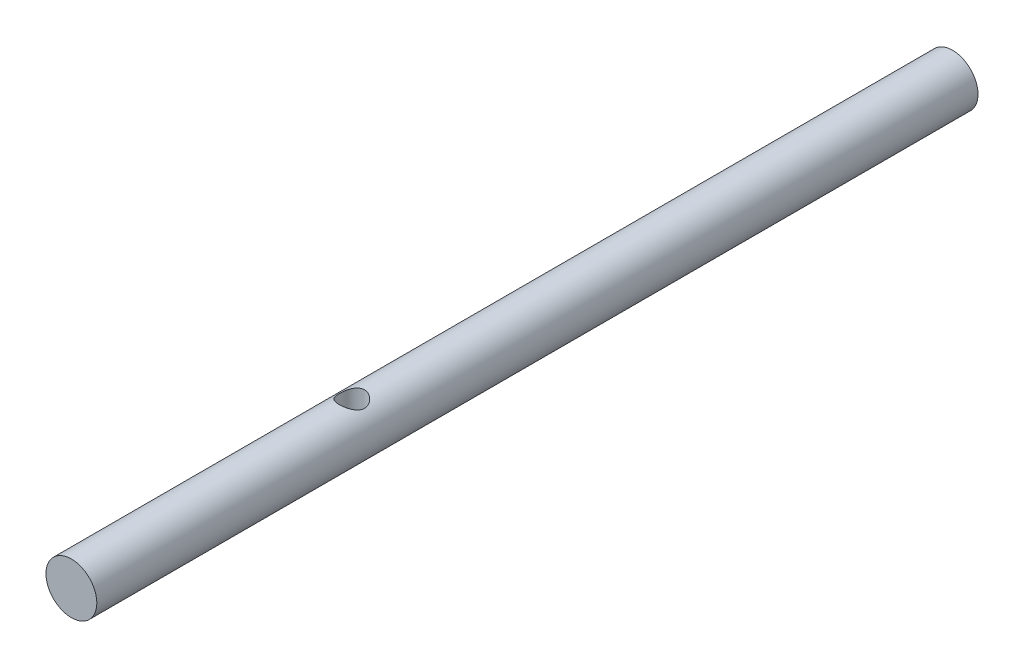
ISO-10303-21;
HEADER;
FILE_DESCRIPTION(('STEP AP214'),'2;1');
FILE_NAME('part.step','',(''),(''),'','','');
FILE_SCHEMA(('AUTOMOTIVE_DESIGN { 1 0 10303 214 1 1 1 1 }'));
ENDSEC;
DATA;
#1=APPLICATION_CONTEXT('core data for automotive mechanical design processes');
#2=APPLICATION_PROTOCOL_DEFINITION('international standard','automotive_design',2000,#1);
#3=PRODUCT_CONTEXT('',#1,'mechanical');
#4=PRODUCT('Part','Part','',(#3));
#5=PRODUCT_RELATED_PRODUCT_CATEGORY('part','',(#4));
#6=PRODUCT_DEFINITION_FORMATION('','',#4);
#7=PRODUCT_DEFINITION_CONTEXT('part definition',#1,'design');
#8=PRODUCT_DEFINITION('design','',#6,#7);
#9=PRODUCT_DEFINITION_SHAPE('','',#8);
#10=(LENGTH_UNIT() NAMED_UNIT(*) SI_UNIT(.MILLI.,.METRE.));
#11=(NAMED_UNIT(*) PLANE_ANGLE_UNIT() SI_UNIT($,.RADIAN.));
#12=(NAMED_UNIT(*) SI_UNIT($,.STERADIAN.) SOLID_ANGLE_UNIT());
#13=UNCERTAINTY_MEASURE_WITH_UNIT(LENGTH_MEASURE(1.E-05),#10,'distance_accuracy_value','');
#14=(GEOMETRIC_REPRESENTATION_CONTEXT(3) GLOBAL_UNCERTAINTY_ASSIGNED_CONTEXT((#13)) GLOBAL_UNIT_ASSIGNED_CONTEXT((#10,
#11,#12)) REPRESENTATION_CONTEXT('',''));
#15=CARTESIAN_POINT('',(0.,0.,0.));
#16=DIRECTION('',(0.,0.,1.));
#17=DIRECTION('',(1.,0.,0.));
#18=AXIS2_PLACEMENT_3D('',#15,#16,#17);
#19=CARTESIAN_POINT('',(0.,0.,27.5));
#20=DIRECTION('',(0.,0.,-1.));
#21=DIRECTION('',(-1.,0.,0.));
#22=AXIS2_PLACEMENT_3D('',#19,#20,#21);
#23=CYLINDRICAL_SURFACE('',#22,1.5875);
#24=CARTESIAN_POINT('',(0.,-1.5875,10.79375));
#25=CARTESIAN_POINT('',(0.041728995593933,-1.58749772514545,10.7937473787839));
#26=CARTESIAN_POINT('',(0.0835077385103134,-1.58583702246742,10.7904400044597));
#27=CARTESIAN_POINT('',(0.165830436744312,-1.57935736354683,10.7773567762294));
#28=CARTESIAN_POINT('',(0.206371893828843,-1.57453240964256,10.7675686380581));
#29=CARTESIAN_POINT('',(0.284903501248956,-1.56222921776378,10.7420024144104));
#30=CARTESIAN_POINT('',(0.322902899832974,-1.55476129847157,10.7262476075031));
#31=CARTESIAN_POINT('',(0.395662639590211,-1.53785710109399,10.6893158192916));
#32=CARTESIAN_POINT('',(0.430423235854602,-1.52842097821614,10.6681392655025));
#33=CARTESIAN_POINT('',(0.498084330348523,-1.50777779992333,10.619508183221));
#34=CARTESIAN_POINT('',(0.530745073828176,-1.49649814307482,10.5917513571035));
#35=CARTESIAN_POINT('',(0.591168684363163,-1.47367601383353,10.5313985758477));
#36=CARTESIAN_POINT('',(0.618927819090996,-1.46213334865921,10.4987989676556));
#37=CARTESIAN_POINT('',(0.670918775357408,-1.43906042512894,10.4266538413158));
#38=CARTESIAN_POINT('',(0.694710110094112,-1.42760054657542,10.3867657219379));
#39=CARTESIAN_POINT('',(0.735146030094489,-1.40720745650529,10.3029209270609));
#40=CARTESIAN_POINT('',(0.751795720629527,-1.39827244163048,10.2589671853263));
#41=CARTESIAN_POINT('',(0.776392625987191,-1.3847593196126,10.1709220725713));
#42=CARTESIAN_POINT('',(0.7848011490576,-1.37995240569573,10.1269964661715));
#43=CARTESIAN_POINT('',(0.794088925938896,-1.37463125146644,10.0381167975125));
#44=CARTESIAN_POINT('',(0.794975620146127,-1.37411276916235,9.99316379568352));
#45=CARTESIAN_POINT('',(0.789533034193008,-1.37724300891691,9.90928546819968));
#46=CARTESIAN_POINT('',(0.784053994132352,-1.38040081156723,9.8702821752167));
#47=CARTESIAN_POINT('',(0.76750850518894,-1.38966756557494,9.79384573443515));
#48=CARTESIAN_POINT('',(0.756440276468761,-1.39577745697722,9.75641309091391));
#49=CARTESIAN_POINT('',(0.72882901318139,-1.41039434402613,9.68311187602601));
#50=CARTESIAN_POINT('',(0.712164459523321,-1.41895386027049,9.64730004596378));
#51=CARTESIAN_POINT('',(0.673926839586477,-1.43750827148364,9.57880903025668));
#52=CARTESIAN_POINT('',(0.652351568526146,-1.44750381044276,9.54613126111743));
#53=CARTESIAN_POINT('',(0.601714931087026,-1.46933569085733,9.48047375563506));
#54=CARTESIAN_POINT('',(0.572051226330618,-1.48124473750417,9.44798110659892));
#55=CARTESIAN_POINT('',(0.507647240625965,-1.50453425994698,9.38822876149347));
#56=CARTESIAN_POINT('',(0.472904547405839,-1.51591448117298,9.3609715663231));
#57=CARTESIAN_POINT('',(0.39728497650403,-1.53750952405853,9.31127450655765));
#58=CARTESIAN_POINT('',(0.356198163332031,-1.54764568678593,9.28911712499619));
#59=CARTESIAN_POINT('',(0.270245058544233,-1.56494068139986,9.25221048319711));
#60=CARTESIAN_POINT('',(0.225381801160563,-1.57210187661445,9.23745534064421));
#61=CARTESIAN_POINT('',(0.137133402755682,-1.58213689907265,9.21698514829989));
#62=CARTESIAN_POINT('',(0.0939335898727325,-1.58531669776666,9.21062258162599));
#63=CARTESIAN_POINT('',(0.00696880745979958,-1.58807954433162,9.205087369662));
#64=CARTESIAN_POINT('',(-0.036795884521734,-1.58766429610042,9.20591131827366));
#65=CARTESIAN_POINT('',(-0.120041171513882,-1.58346133851169,9.21435155893238));
#66=CARTESIAN_POINT('',(-0.159590905139651,-1.57993751265,9.22143644785446));
#67=CARTESIAN_POINT('',(-0.236860470764646,-1.57021348481137,9.24136396956672));
#68=CARTESIAN_POINT('',(-0.274580100517228,-1.56401298777876,9.25420723712235));
#69=CARTESIAN_POINT('',(-0.348367832956921,-1.549274995596,9.28562378273133));
#70=CARTESIAN_POINT('',(-0.384357877623634,-1.54067574904889,9.30435039603022));
#71=CARTESIAN_POINT('',(-0.452803705848518,-1.52196779614205,9.34682910641904));
#72=CARTESIAN_POINT('',(-0.485257974884129,-1.51185844730342,9.37058334433353));
#73=CARTESIAN_POINT('',(-0.549090603374456,-1.48993400686612,9.42513483760797));
#74=CARTESIAN_POINT('',(-0.580050336773307,-1.4780488984845,9.45639465183502));
#75=CARTESIAN_POINT('',(-0.636473454883634,-1.45464523335575,9.52369058882001));
#76=CARTESIAN_POINT('',(-0.661933037392105,-1.44312693484086,9.5597299880605));
#77=CARTESIAN_POINT('',(-0.707793157132545,-1.42121883829441,9.63776715052149));
#78=CARTESIAN_POINT('',(-0.727888987353668,-1.41091070420381,9.67996894255307));
#79=CARTESIAN_POINT('',(-0.760478243148456,-1.393619199422,9.76783611623094));
#80=CARTESIAN_POINT('',(-0.772981464485759,-1.38663154728491,9.81349694916032));
#81=CARTESIAN_POINT('',(-0.788877714413182,-1.37764441425629,9.90229748939627));
#82=CARTESIAN_POINT('',(-0.793030065893186,-1.37523048121765,9.9452584386593));
#83=CARTESIAN_POINT('',(-0.794297016289749,-1.37450000250401,10.0313111095668));
#84=CARTESIAN_POINT('',(-0.791414665758116,-1.3761816807937,10.0744027664369));
#85=CARTESIAN_POINT('',(-0.779403862188859,-1.38301303002207,10.155165029341));
#86=CARTESIAN_POINT('',(-0.770896599509597,-1.387817062454,10.1929609981771));
#87=CARTESIAN_POINT('',(-0.748645440590813,-1.39994494099159,10.2665476947934));
#88=CARTESIAN_POINT('',(-0.7348998598581,-1.4072695975843,10.3023377732855));
#89=CARTESIAN_POINT('',(-0.701528747832417,-1.42421395976844,10.3735584754706));
#90=CARTESIAN_POINT('',(-0.681570215641813,-1.43395479651976,10.4088033970773));
#91=CARTESIAN_POINT('',(-0.636707333736578,-1.45443044484956,10.4756741630933));
#92=CARTESIAN_POINT('',(-0.611800410920677,-1.46516577199402,10.5072981110991));
#93=CARTESIAN_POINT('',(-0.55419889054006,-1.48798219007705,10.5700251984964));
#94=CARTESIAN_POINT('',(-0.520925760764324,-1.50006830503478,10.6005981624998));
#95=CARTESIAN_POINT('',(-0.449385377437347,-1.52302965852476,10.6558462430925));
#96=CARTESIAN_POINT('',(-0.411115449085074,-1.53390424270132,10.6805181806696));
#97=CARTESIAN_POINT('',(-0.330145704975833,-1.55335295108176,10.7232938629425));
#98=CARTESIAN_POINT('',(-0.2874164812481,-1.56191026646809,10.7413499344703));
#99=CARTESIAN_POINT('',(-0.199026542902264,-1.57560439707251,10.7697852332857));
#100=CARTESIAN_POINT('',(-0.153374565950888,-1.58075092927265,10.780186278421));
#101=CARTESIAN_POINT('',(-0.089377795021186,-1.58508272890795,10.7889060700415));
#102=CARTESIAN_POINT('',(-0.0715659918051022,-1.58598683737991,10.7907199711855));
#103=CARTESIAN_POINT('',(-0.0358391871219314,-1.5871959697618,10.793142515754));
#104=CARTESIAN_POINT('',(-0.017924182820109,-1.58750097713612,10.7937511259115));
#105=CARTESIAN_POINT('',(0.,-1.5875,10.79375));
#106=B_SPLINE_CURVE_WITH_KNOTS('',3,(#24,#25,#26,#27,#28,#29,#30,#31,#32,#33,#34,#35,#36,#37,
#38,#39,#40,#41,#42,#43,#44,#45,#46,#47,#48,#49,#50,#51,#52,#53,#54,#55,#56,#57,#58,#59,#60,#61,
#62,#63,#64,#65,#66,#67,#68,#69,#70,#71,#72,#73,#74,#75,#76,#77,#78,#79,#80,#81,#82,#83,#84,#85,
#86,#87,#88,#89,#90,#91,#92,#93,#94,#95,#96,#97,#98,#99,#100,#101,#102,#103,#104,#105),
.UNSPECIFIED.,.T.,.F.,(4,2,2,2,2,2,2,2,2,2,2,2,2,2,2,2,2,2,2,2,2,2,2,2,2,2,2,2,2,2,2,2,2,2,2,2,
2,2,2,2,4),(0.,0.125114254327357,0.250466343831675,0.375334335922012,0.500192484961618,
0.632604270982483,0.765116451137891,0.907904953544098,1.0505912114426,1.18473547136307,
1.3187470237991,1.43673284224898,1.55475625616007,1.67552878133737,1.79635563750301,
1.93250297183766,2.06871518087707,2.21125273882712,2.35367684674122,2.4843048681163,
2.61487098080984,2.73531732039234,2.85577694044552,2.97968079472144,3.10363751531494,
3.23976690949007,3.37599010963499,3.51881028964241,3.66144581352992,3.79038887826834,
3.91927603763879,4.03588482131319,4.15253113472044,4.27701437565643,4.40156251654047,
4.54124411434795,4.68100079305154,4.82174560844946,4.96208771221038,5.01582753609297,
5.06956884321159),.UNSPECIFIED.);
#107=CARTESIAN_POINT('',(0.,-1.5875,10.79375));
#108=VERTEX_POINT('',#107);
#109=EDGE_CURVE('E10',#108,#108,#106,.T.);
#110=ORIENTED_EDGE('',*,*,#109,.T.);
#111=EDGE_LOOP('',(#110));
#112=FACE_BOUND('',#111,.T.);
#113=CARTESIAN_POINT('',(0.,1.5875,10.79375));
#114=CARTESIAN_POINT('',(-0.041728995593933,1.58749772514545,10.7937473787839));
#115=CARTESIAN_POINT('',(-0.0835077385103134,1.58583702246742,10.7904400044597));
#116=CARTESIAN_POINT('',(-0.165830436744312,1.57935736354683,10.7773567762294));
#117=CARTESIAN_POINT('',(-0.206371893828843,1.57453240964256,10.7675686380581));
#118=CARTESIAN_POINT('',(-0.284903501248956,1.56222921776378,10.7420024144104));
#119=CARTESIAN_POINT('',(-0.322902899832974,1.55476129847157,10.7262476075031));
#120=CARTESIAN_POINT('',(-0.395662639590211,1.53785710109399,10.6893158192916));
#121=CARTESIAN_POINT('',(-0.430423235854602,1.52842097821614,10.6681392655025));
#122=CARTESIAN_POINT('',(-0.498084330348523,1.50777779992333,10.619508183221));
#123=CARTESIAN_POINT('',(-0.530745073828176,1.49649814307482,10.5917513571035));
#124=CARTESIAN_POINT('',(-0.591168684363163,1.47367601383353,10.5313985758477));
#125=CARTESIAN_POINT('',(-0.618927819090996,1.46213334865921,10.4987989676556));
#126=CARTESIAN_POINT('',(-0.670918775357408,1.43906042512894,10.4266538413158));
#127=CARTESIAN_POINT('',(-0.694710110094112,1.42760054657542,10.3867657219379));
#128=CARTESIAN_POINT('',(-0.735146030094489,1.40720745650529,10.3029209270609));
#129=CARTESIAN_POINT('',(-0.751795720629527,1.39827244163048,10.2589671853263));
#130=CARTESIAN_POINT('',(-0.776392625987191,1.3847593196126,10.1709220725713));
#131=CARTESIAN_POINT('',(-0.7848011490576,1.37995240569573,10.1269964661715));
#132=CARTESIAN_POINT('',(-0.794088925938896,1.37463125146644,10.0381167975125));
#133=CARTESIAN_POINT('',(-0.794975620146127,1.37411276916235,9.99316379568352));
#134=CARTESIAN_POINT('',(-0.789533034193008,1.37724300891691,9.90928546819968));
#135=CARTESIAN_POINT('',(-0.784053994132352,1.38040081156723,9.8702821752167));
#136=CARTESIAN_POINT('',(-0.76750850518894,1.38966756557494,9.79384573443515));
#137=CARTESIAN_POINT('',(-0.756440276468761,1.39577745697722,9.75641309091391));
#138=CARTESIAN_POINT('',(-0.72882901318139,1.41039434402613,9.68311187602601));
#139=CARTESIAN_POINT('',(-0.712164459523321,1.41895386027049,9.64730004596378));
#140=CARTESIAN_POINT('',(-0.673926839586477,1.43750827148364,9.57880903025668));
#141=CARTESIAN_POINT('',(-0.652351568526146,1.44750381044276,9.54613126111743));
#142=CARTESIAN_POINT('',(-0.601714931087026,1.46933569085733,9.48047375563506));
#143=CARTESIAN_POINT('',(-0.572051226330618,1.48124473750417,9.44798110659892));
#144=CARTESIAN_POINT('',(-0.507647240625965,1.50453425994698,9.38822876149347));
#145=CARTESIAN_POINT('',(-0.472904547405839,1.51591448117298,9.3609715663231));
#146=CARTESIAN_POINT('',(-0.39728497650403,1.53750952405853,9.31127450655765));
#147=CARTESIAN_POINT('',(-0.356198163332031,1.54764568678593,9.28911712499619));
#148=CARTESIAN_POINT('',(-0.270245058544233,1.56494068139986,9.25221048319711));
#149=CARTESIAN_POINT('',(-0.225381801160563,1.57210187661445,9.23745534064421));
#150=CARTESIAN_POINT('',(-0.137133402755682,1.58213689907265,9.21698514829989));
#151=CARTESIAN_POINT('',(-0.0939335898727325,1.58531669776666,9.21062258162599));
#152=CARTESIAN_POINT('',(-0.00696880745979958,1.58807954433162,9.205087369662));
#153=CARTESIAN_POINT('',(0.036795884521734,1.58766429610042,9.20591131827366));
#154=CARTESIAN_POINT('',(0.120041171513882,1.58346133851169,9.21435155893238));
#155=CARTESIAN_POINT('',(0.159590905139651,1.57993751265,9.22143644785446));
#156=CARTESIAN_POINT('',(0.236860470764646,1.57021348481137,9.24136396956672));
#157=CARTESIAN_POINT('',(0.274580100517228,1.56401298777876,9.25420723712235));
#158=CARTESIAN_POINT('',(0.348367832956921,1.549274995596,9.28562378273133));
#159=CARTESIAN_POINT('',(0.384357877623634,1.54067574904889,9.30435039603022));
#160=CARTESIAN_POINT('',(0.452803705848518,1.52196779614205,9.34682910641904));
#161=CARTESIAN_POINT('',(0.485257974884129,1.51185844730342,9.37058334433353));
#162=CARTESIAN_POINT('',(0.549090603374456,1.48993400686612,9.42513483760797));
#163=CARTESIAN_POINT('',(0.580050336773307,1.4780488984845,9.45639465183502));
#164=CARTESIAN_POINT('',(0.636473454883634,1.45464523335575,9.52369058882001));
#165=CARTESIAN_POINT('',(0.661933037392105,1.44312693484086,9.5597299880605));
#166=CARTESIAN_POINT('',(0.707793157132545,1.42121883829441,9.63776715052149));
#167=CARTESIAN_POINT('',(0.727888987353668,1.41091070420381,9.67996894255307));
#168=CARTESIAN_POINT('',(0.760478243148456,1.393619199422,9.76783611623094));
#169=CARTESIAN_POINT('',(0.772981464485759,1.38663154728491,9.81349694916032));
#170=CARTESIAN_POINT('',(0.788877714413182,1.37764441425629,9.90229748939627));
#171=CARTESIAN_POINT('',(0.793030065893186,1.37523048121765,9.9452584386593));
#172=CARTESIAN_POINT('',(0.794297016289749,1.37450000250401,10.0313111095668));
#173=CARTESIAN_POINT('',(0.791414665758116,1.3761816807937,10.0744027664369));
#174=CARTESIAN_POINT('',(0.779403862188859,1.38301303002207,10.155165029341));
#175=CARTESIAN_POINT('',(0.770896599509597,1.387817062454,10.1929609981771));
#176=CARTESIAN_POINT('',(0.748645440590813,1.39994494099159,10.2665476947934));
#177=CARTESIAN_POINT('',(0.7348998598581,1.4072695975843,10.3023377732855));
#178=CARTESIAN_POINT('',(0.701528747832417,1.42421395976844,10.3735584754706));
#179=CARTESIAN_POINT('',(0.681570215641813,1.43395479651976,10.4088033970773));
#180=CARTESIAN_POINT('',(0.636707333736578,1.45443044484956,10.4756741630933));
#181=CARTESIAN_POINT('',(0.611800410920677,1.46516577199402,10.5072981110991));
#182=CARTESIAN_POINT('',(0.55419889054006,1.48798219007705,10.5700251984964));
#183=CARTESIAN_POINT('',(0.520925760764324,1.50006830503478,10.6005981624998));
#184=CARTESIAN_POINT('',(0.449385377437347,1.52302965852476,10.6558462430925));
#185=CARTESIAN_POINT('',(0.411115449085074,1.53390424270132,10.6805181806696));
#186=CARTESIAN_POINT('',(0.330145704975833,1.55335295108176,10.7232938629425));
#187=CARTESIAN_POINT('',(0.2874164812481,1.56191026646809,10.7413499344703));
#188=CARTESIAN_POINT('',(0.199026542902264,1.57560439707251,10.7697852332857));
#189=CARTESIAN_POINT('',(0.153374565950888,1.58075092927265,10.780186278421));
#190=CARTESIAN_POINT('',(0.089377795021186,1.58508272890795,10.7889060700415));
#191=CARTESIAN_POINT('',(0.0715659918051022,1.58598683737991,10.7907199711855));
#192=CARTESIAN_POINT('',(0.0358391871219314,1.5871959697618,10.793142515754));
#193=CARTESIAN_POINT('',(0.017924182820109,1.58750097713612,10.7937511259115));
#194=CARTESIAN_POINT('',(0.,1.5875,10.79375));
#195=B_SPLINE_CURVE_WITH_KNOTS('',3,(#113,#114,#115,#116,#117,#118,#119,#120,#121,#122,#123,
#124,#125,#126,#127,#128,#129,#130,#131,#132,#133,#134,#135,#136,#137,#138,#139,#140,#141,#142,
#143,#144,#145,#146,#147,#148,#149,#150,#151,#152,#153,#154,#155,#156,#157,#158,#159,#160,#161,
#162,#163,#164,#165,#166,#167,#168,#169,#170,#171,#172,#173,#174,#175,#176,#177,#178,#179,#180,
#181,#182,#183,#184,#185,#186,#187,#188,#189,#190,#191,#192,#193,#194),.UNSPECIFIED.,.T.,.F.,(4,
2,2,2,2,2,2,2,2,2,2,2,2,2,2,2,2,2,2,2,2,2,2,2,2,2,2,2,2,2,2,2,2,2,2,2,2,2,2,2,4),(0.,
0.125114254327357,0.250466343831675,0.375334335922012,0.500192484961618,0.632604270982483,
0.765116451137891,0.907904953544098,1.0505912114426,1.18473547136307,1.3187470237991,
1.43673284224898,1.55475625616007,1.67552878133737,1.79635563750301,1.93250297183766,
2.06871518087707,2.21125273882712,2.35367684674122,2.4843048681163,2.61487098080984,
2.73531732039234,2.85577694044552,2.97968079472144,3.10363751531494,3.23976690949007,
3.37599010963499,3.51881028964241,3.66144581352992,3.79038887826834,3.91927603763879,
4.03588482131319,4.15253113472044,4.27701437565643,4.40156251654047,4.54124411434795,
4.68100079305154,4.82174560844946,4.96208771221038,5.01582753609297,5.06956884321159),.UNSPECIFIED.);
#196=CARTESIAN_POINT('',(0.,1.5875,10.79375));
#197=VERTEX_POINT('',#196);
#198=EDGE_CURVE('E42',#197,#197,#195,.T.);
#199=ORIENTED_EDGE('',*,*,#198,.T.);
#200=EDGE_LOOP('',(#199));
#201=FACE_BOUND('',#200,.T.);
#202=CARTESIAN_POINT('',(0.,0.,27.5));
#203=DIRECTION('',(0.,0.,1.));
#204=DIRECTION('',(1.,0.,0.));
#205=AXIS2_PLACEMENT_3D('',#202,#203,#204);
#206=CIRCLE('',#205,1.5875);
#207=CARTESIAN_POINT('',(1.5875,0.,27.5));
#208=VERTEX_POINT('',#207);
#209=EDGE_CURVE('E46',#208,#208,#206,.T.);
#210=ORIENTED_EDGE('',*,*,#209,.F.);
#211=EDGE_LOOP('',(#210));
#212=FACE_BOUND('',#211,.T.);
#213=CARTESIAN_POINT('',(0.,0.,-27.5));
#214=DIRECTION('',(0.,0.,1.));
#215=DIRECTION('',(1.,0.,0.));
#216=AXIS2_PLACEMENT_3D('',#213,#214,#215);
#217=CIRCLE('',#216,1.5875);
#218=CARTESIAN_POINT('',(1.5875,0.,-27.5));
#219=VERTEX_POINT('',#218);
#220=EDGE_CURVE('E50',#219,#219,#217,.T.);
#221=ORIENTED_EDGE('',*,*,#220,.T.);
#222=EDGE_LOOP('',(#221));
#223=FACE_BOUND('',#222,.T.);
#224=ADVANCED_FACE('F32',(#112,#201,#212,#223),#23,.T.);
#225=CARTESIAN_POINT('',(0.,0.,27.5));
#226=DIRECTION('',(0.,0.,1.));
#227=DIRECTION('',(1.,0.,0.));
#228=AXIS2_PLACEMENT_3D('',#225,#226,#227);
#229=PLANE('',#228);
#230=ORIENTED_EDGE('',*,*,#209,.T.);
#231=EDGE_LOOP('',(#230));
#232=FACE_BOUND('',#231,.T.);
#233=ADVANCED_FACE('F61',(#232),#229,.T.);
#234=CARTESIAN_POINT('',(0.,0.,-27.5));
#235=DIRECTION('',(0.,0.,1.));
#236=DIRECTION('',(1.,0.,0.));
#237=AXIS2_PLACEMENT_3D('',#234,#235,#236);
#238=PLANE('',#237);
#239=ORIENTED_EDGE('',*,*,#220,.F.);
#240=EDGE_LOOP('',(#239));
#241=FACE_BOUND('',#240,.T.);
#242=ADVANCED_FACE('F59',(#241),#238,.F.);
#243=CARTESIAN_POINT('',(0.,-1.5875,10.));
#244=DIRECTION('',(0.,1.,0.));
#245=DIRECTION('',(0.,0.,1.));
#246=AXIS2_PLACEMENT_3D('',#243,#244,#245);
#247=CYLINDRICAL_SURFACE('',#246,0.79375);
#248=ORIENTED_EDGE('',*,*,#198,.F.);
#249=EDGE_LOOP('',(#248));
#250=FACE_BOUND('',#249,.T.);
#251=ORIENTED_EDGE('',*,*,#109,.F.);
#252=EDGE_LOOP('',(#251));
#253=FACE_BOUND('',#252,.T.);
#254=ADVANCED_FACE('F55',(#250,#253),#247,.F.);
#255=CLOSED_SHELL('',(#224,#233,#242,#254));
#256=MANIFOLD_SOLID_BREP('B2',#255);
#257=ADVANCED_BREP_SHAPE_REPRESENTATION('',(#18,#256),#14);
#258=SHAPE_DEFINITION_REPRESENTATION(#9,#257);
ENDSEC;
END-ISO-10303-21;
